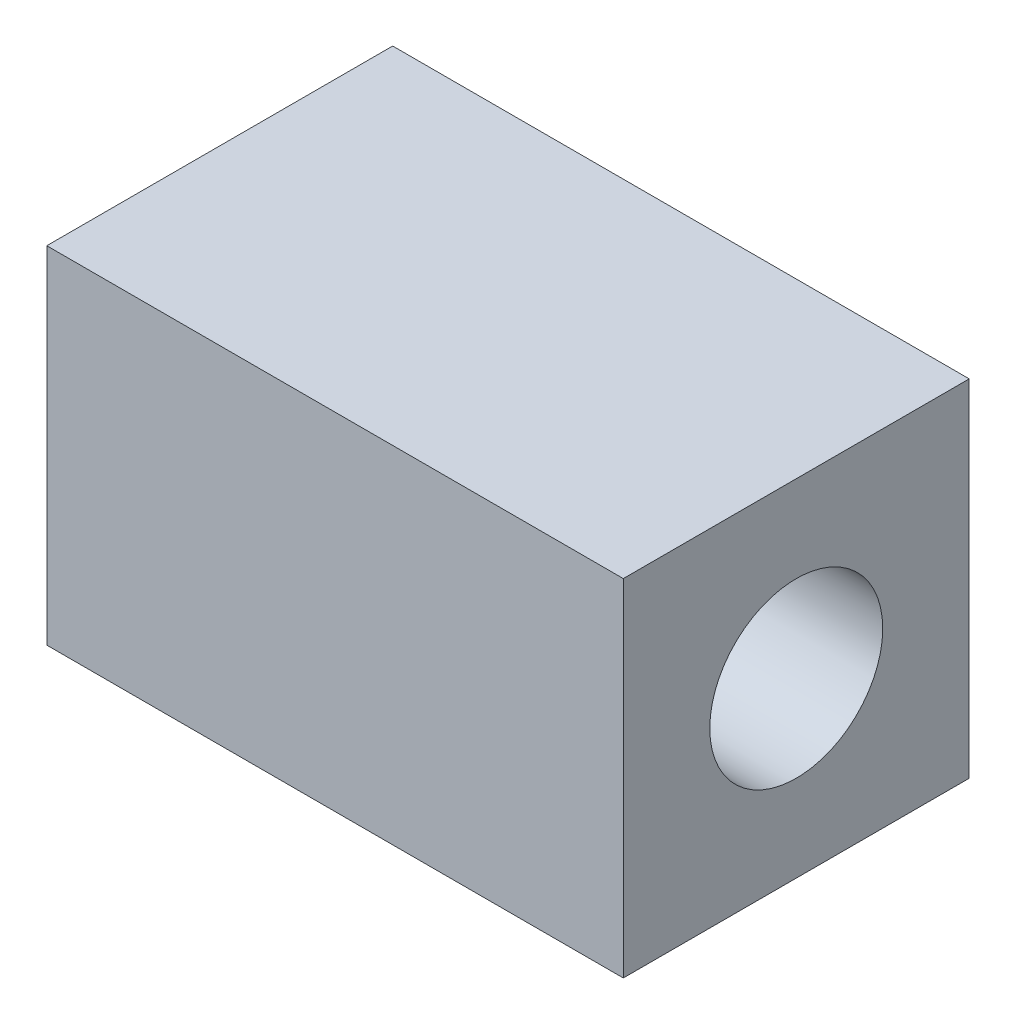
ISO-10303-21;
HEADER;
FILE_DESCRIPTION(('STEP AP214'),'2;1');
FILE_NAME('part.step','',(''),(''),'','','');
FILE_SCHEMA(('AUTOMOTIVE_DESIGN { 1 0 10303 214 1 1 1 1 }'));
ENDSEC;
DATA;
#1=APPLICATION_CONTEXT('core data for automotive mechanical design processes');
#2=APPLICATION_PROTOCOL_DEFINITION('international standard','automotive_design',2000,#1);
#3=PRODUCT_CONTEXT('',#1,'mechanical');
#4=PRODUCT('Part','Part','',(#3));
#5=PRODUCT_RELATED_PRODUCT_CATEGORY('part','',(#4));
#6=PRODUCT_DEFINITION_FORMATION('','',#4);
#7=PRODUCT_DEFINITION_CONTEXT('part definition',#1,'design');
#8=PRODUCT_DEFINITION('design','',#6,#7);
#9=PRODUCT_DEFINITION_SHAPE('','',#8);
#10=(LENGTH_UNIT() NAMED_UNIT(*) SI_UNIT(.MILLI.,.METRE.));
#11=(NAMED_UNIT(*) PLANE_ANGLE_UNIT() SI_UNIT($,.RADIAN.));
#12=(NAMED_UNIT(*) SI_UNIT($,.STERADIAN.) SOLID_ANGLE_UNIT());
#13=UNCERTAINTY_MEASURE_WITH_UNIT(LENGTH_MEASURE(1.E-05),#10,'distance_accuracy_value','');
#14=(GEOMETRIC_REPRESENTATION_CONTEXT(3) GLOBAL_UNCERTAINTY_ASSIGNED_CONTEXT((#13)) GLOBAL_UNIT_ASSIGNED_CONTEXT((#10,
#11,#12)) REPRESENTATION_CONTEXT('',''));
#15=CARTESIAN_POINT('',(0.,0.,0.));
#16=DIRECTION('',(0.,0.,1.));
#17=DIRECTION('',(1.,0.,0.));
#18=AXIS2_PLACEMENT_3D('',#15,#16,#17);
#19=CARTESIAN_POINT('',(-39.2278175766711,-15.,15.));
#20=DIRECTION('',(-1.,0.,0.));
#21=DIRECTION('',(0.,0.,1.));
#22=AXIS2_PLACEMENT_3D('',#19,#20,#21);
#23=PLANE('',#22);
#24=CARTESIAN_POINT('',(-39.2278175766711,0.,0.));
#25=DIRECTION('',(-1.,0.,0.));
#26=DIRECTION('',(0.,0.,1.));
#27=AXIS2_PLACEMENT_3D('',#24,#25,#26);
#28=CIRCLE('',#27,7.5);
#29=CARTESIAN_POINT('',(-39.2278175766711,0.,7.5));
#30=VERTEX_POINT('',#29);
#31=EDGE_CURVE('E99',#30,#30,#28,.T.);
#32=ORIENTED_EDGE('',*,*,#31,.T.);
#33=EDGE_LOOP('',(#32));
#34=FACE_BOUND('',#33,.T.);
#35=DIRECTION('',(0.,1.,0.));
#36=VECTOR('',#35,1.);
#37=CARTESIAN_POINT('',(-39.2278175766711,-15.,-15.));
#38=LINE('',#37,#36);
#39=CARTESIAN_POINT('',(-39.2278175766711,-15.,-15.));
#40=VERTEX_POINT('',#39);
#41=CARTESIAN_POINT('',(-39.2278175766711,15.,-15.));
#42=VERTEX_POINT('',#41);
#43=EDGE_CURVE('E96',#40,#42,#38,.T.);
#44=ORIENTED_EDGE('',*,*,#43,.T.);
#45=DIRECTION('',(0.,0.,-1.));
#46=VECTOR('',#45,1.);
#47=CARTESIAN_POINT('',(-39.2278175766711,15.,15.));
#48=LINE('',#47,#46);
#49=CARTESIAN_POINT('',(-39.2278175766711,15.,15.));
#50=VERTEX_POINT('',#49);
#51=EDGE_CURVE('E11',#50,#42,#48,.T.);
#52=ORIENTED_EDGE('',*,*,#51,.F.);
#53=DIRECTION('',(0.,1.,0.));
#54=VECTOR('',#53,1.);
#55=CARTESIAN_POINT('',(-39.2278175766711,-15.,15.));
#56=LINE('',#55,#54);
#57=CARTESIAN_POINT('',(-39.2278175766711,-15.,15.));
#58=VERTEX_POINT('',#57);
#59=EDGE_CURVE('E84',#58,#50,#56,.T.);
#60=ORIENTED_EDGE('',*,*,#59,.F.);
#61=DIRECTION('',(0.,0.,-1.));
#62=VECTOR('',#61,1.);
#63=CARTESIAN_POINT('',(-39.2278175766711,-15.,15.));
#64=LINE('',#63,#62);
#65=EDGE_CURVE('E92',#58,#40,#64,.T.);
#66=ORIENTED_EDGE('',*,*,#65,.T.);
#67=EDGE_LOOP('',(#44,#52,#60,#66));
#68=FACE_BOUND('',#67,.T.);
#69=ADVANCED_FACE('F33',(#34,#68),#23,.F.);
#70=CARTESIAN_POINT('',(-89.2278175766711,15.,15.));
#71=DIRECTION('',(0.,-1.,0.));
#72=DIRECTION('',(0.,0.,-1.));
#73=AXIS2_PLACEMENT_3D('',#70,#71,#72);
#74=PLANE('',#73);
#75=DIRECTION('',(-1.,0.,0.));
#76=VECTOR('',#75,1.);
#77=CARTESIAN_POINT('',(-89.2278175766711,15.,-15.));
#78=LINE('',#77,#76);
#79=CARTESIAN_POINT('',(-89.2278175766711,15.,-15.));
#80=VERTEX_POINT('',#79);
#81=EDGE_CURVE('E88',#42,#80,#78,.T.);
#82=ORIENTED_EDGE('',*,*,#81,.T.);
#83=DIRECTION('',(0.,0.,-1.));
#84=VECTOR('',#83,1.);
#85=CARTESIAN_POINT('',(-89.2278175766711,15.,15.));
#86=LINE('',#85,#84);
#87=CARTESIAN_POINT('',(-89.2278175766711,15.,15.));
#88=VERTEX_POINT('',#87);
#89=EDGE_CURVE('E41',#88,#80,#86,.T.);
#90=ORIENTED_EDGE('',*,*,#89,.F.);
#91=DIRECTION('',(-1.,0.,0.));
#92=VECTOR('',#91,1.);
#93=CARTESIAN_POINT('',(-89.2278175766711,15.,15.));
#94=LINE('',#93,#92);
#95=EDGE_CURVE('E79',#50,#88,#94,.T.);
#96=ORIENTED_EDGE('',*,*,#95,.F.);
#97=ORIENTED_EDGE('',*,*,#51,.T.);
#98=EDGE_LOOP('',(#82,#90,#96,#97));
#99=FACE_BOUND('',#98,.T.);
#100=ADVANCED_FACE('F87',(#99),#74,.F.);
#101=CARTESIAN_POINT('',(-89.2278175766711,-15.,15.));
#102=DIRECTION('',(1.,0.,0.));
#103=DIRECTION('',(0.,0.,-1.));
#104=AXIS2_PLACEMENT_3D('',#101,#102,#103);
#105=PLANE('',#104);
#106=CARTESIAN_POINT('',(-89.2278175766711,0.,0.));
#107=DIRECTION('',(-1.,0.,0.));
#108=DIRECTION('',(0.,0.,1.));
#109=AXIS2_PLACEMENT_3D('',#106,#107,#108);
#110=CIRCLE('',#109,7.5);
#111=CARTESIAN_POINT('',(-89.2278175766711,0.,7.5));
#112=VERTEX_POINT('',#111);
#113=EDGE_CURVE('E110',#112,#112,#110,.T.);
#114=ORIENTED_EDGE('',*,*,#113,.F.);
#115=EDGE_LOOP('',(#114));
#116=FACE_BOUND('',#115,.T.);
#117=DIRECTION('',(0.,-1.,0.));
#118=VECTOR('',#117,1.);
#119=CARTESIAN_POINT('',(-89.2278175766711,-15.,-15.));
#120=LINE('',#119,#118);
#121=CARTESIAN_POINT('',(-89.2278175766711,-15.,-15.));
#122=VERTEX_POINT('',#121);
#123=EDGE_CURVE('E66',#80,#122,#120,.T.);
#124=ORIENTED_EDGE('',*,*,#123,.T.);
#125=DIRECTION('',(0.,0.,-1.));
#126=VECTOR('',#125,1.);
#127=CARTESIAN_POINT('',(-89.2278175766711,-15.,15.));
#128=LINE('',#127,#126);
#129=CARTESIAN_POINT('',(-89.2278175766711,-15.,15.));
#130=VERTEX_POINT('',#129);
#131=EDGE_CURVE('E89',#130,#122,#128,.T.);
#132=ORIENTED_EDGE('',*,*,#131,.F.);
#133=DIRECTION('',(0.,-1.,0.));
#134=VECTOR('',#133,1.);
#135=CARTESIAN_POINT('',(-89.2278175766711,-15.,15.));
#136=LINE('',#135,#134);
#137=EDGE_CURVE('E82',#88,#130,#136,.T.);
#138=ORIENTED_EDGE('',*,*,#137,.F.);
#139=ORIENTED_EDGE('',*,*,#89,.T.);
#140=EDGE_LOOP('',(#124,#132,#138,#139));
#141=FACE_BOUND('',#140,.T.);
#142=ADVANCED_FACE('F90',(#116,#141),#105,.F.);
#143=CARTESIAN_POINT('',(-89.2278175766711,-15.,15.));
#144=DIRECTION('',(0.,1.,0.));
#145=DIRECTION('',(0.,0.,1.));
#146=AXIS2_PLACEMENT_3D('',#143,#144,#145);
#147=PLANE('',#146);
#148=DIRECTION('',(1.,0.,0.));
#149=VECTOR('',#148,1.);
#150=CARTESIAN_POINT('',(-89.2278175766711,-15.,-15.));
#151=LINE('',#150,#149);
#152=EDGE_CURVE('E72',#122,#40,#151,.T.);
#153=ORIENTED_EDGE('',*,*,#152,.T.);
#154=ORIENTED_EDGE('',*,*,#65,.F.);
#155=DIRECTION('',(1.,0.,0.));
#156=VECTOR('',#155,1.);
#157=CARTESIAN_POINT('',(-89.2278175766711,-15.,15.));
#158=LINE('',#157,#156);
#159=EDGE_CURVE('E49',#130,#58,#158,.T.);
#160=ORIENTED_EDGE('',*,*,#159,.F.);
#161=ORIENTED_EDGE('',*,*,#131,.T.);
#162=EDGE_LOOP('',(#153,#154,#160,#161));
#163=FACE_BOUND('',#162,.T.);
#164=ADVANCED_FACE('F104',(#163),#147,.F.);
#165=CARTESIAN_POINT('',(0.,0.,15.));
#166=DIRECTION('',(0.,0.,-1.));
#167=DIRECTION('',(-1.,0.,0.));
#168=AXIS2_PLACEMENT_3D('',#165,#166,#167);
#169=PLANE('',#168);
#170=ORIENTED_EDGE('',*,*,#59,.T.);
#171=ORIENTED_EDGE('',*,*,#95,.T.);
#172=ORIENTED_EDGE('',*,*,#137,.T.);
#173=ORIENTED_EDGE('',*,*,#159,.T.);
#174=EDGE_LOOP('',(#170,#171,#172,#173));
#175=FACE_BOUND('',#174,.T.);
#176=ADVANCED_FACE('F80',(#175),#169,.F.);
#177=CARTESIAN_POINT('',(0.,0.,-15.));
#178=DIRECTION('',(0.,0.,-1.));
#179=DIRECTION('',(-1.,0.,0.));
#180=AXIS2_PLACEMENT_3D('',#177,#178,#179);
#181=PLANE('',#180);
#182=ORIENTED_EDGE('',*,*,#43,.F.);
#183=ORIENTED_EDGE('',*,*,#152,.F.);
#184=ORIENTED_EDGE('',*,*,#123,.F.);
#185=ORIENTED_EDGE('',*,*,#81,.F.);
#186=EDGE_LOOP('',(#182,#183,#184,#185));
#187=FACE_BOUND('',#186,.T.);
#188=ADVANCED_FACE('F107',(#187),#181,.T.);
#189=CARTESIAN_POINT('',(-39.2278175766711,0.,0.));
#190=DIRECTION('',(-1.,0.,0.));
#191=DIRECTION('',(0.,0.,1.));
#192=AXIS2_PLACEMENT_3D('',#189,#190,#191);
#193=CYLINDRICAL_SURFACE('',#192,7.5);
#194=ORIENTED_EDGE('',*,*,#31,.F.);
#195=EDGE_LOOP('',(#194));
#196=FACE_BOUND('',#195,.T.);
#197=ORIENTED_EDGE('',*,*,#113,.T.);
#198=EDGE_LOOP('',(#197));
#199=FACE_BOUND('',#198,.T.);
#200=ADVANCED_FACE('F117',(#196,#199),#193,.F.);
#201=CLOSED_SHELL('',(#69,#100,#142,#164,#176,#188,#200));
#202=MANIFOLD_SOLID_BREP('B2',#201);
#203=ADVANCED_BREP_SHAPE_REPRESENTATION('',(#18,#202),#14);
#204=SHAPE_DEFINITION_REPRESENTATION(#9,#203);
ENDSEC;
END-ISO-10303-21;
